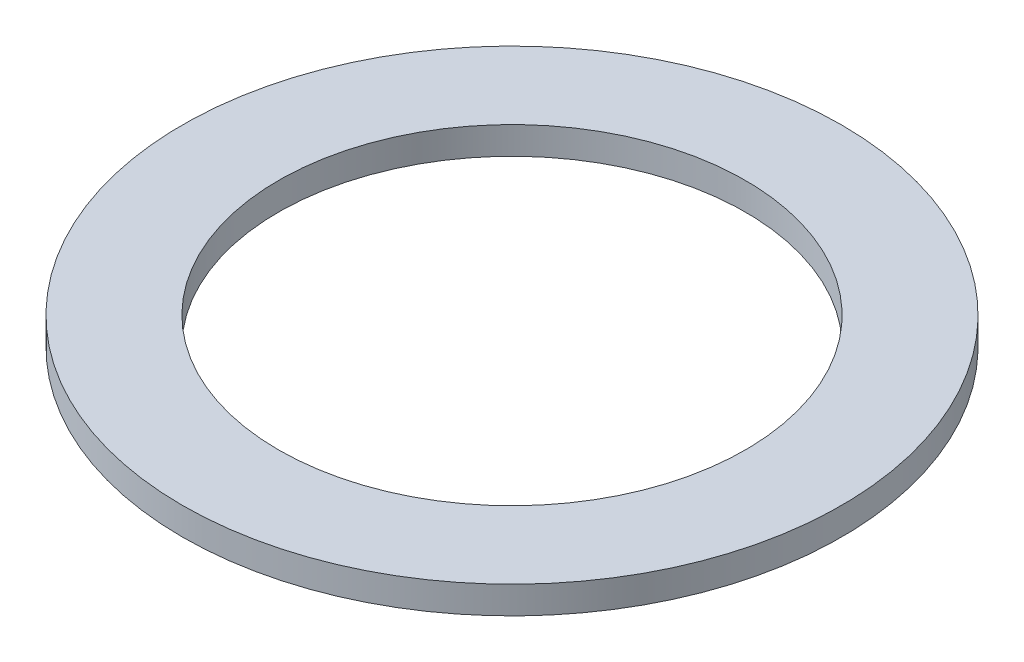
ISO-10303-21;
HEADER;
FILE_DESCRIPTION(('STEP AP214'),'2;1');
FILE_NAME('part.step','',(''),(''),'','','');
FILE_SCHEMA(('AUTOMOTIVE_DESIGN { 1 0 10303 214 1 1 1 1 }'));
ENDSEC;
DATA;
#1=APPLICATION_CONTEXT('core data for automotive mechanical design processes');
#2=APPLICATION_PROTOCOL_DEFINITION('international standard','automotive_design',2000,#1);
#3=PRODUCT_CONTEXT('',#1,'mechanical');
#4=PRODUCT('Part','Part','',(#3));
#5=PRODUCT_RELATED_PRODUCT_CATEGORY('part','',(#4));
#6=PRODUCT_DEFINITION_FORMATION('','',#4);
#7=PRODUCT_DEFINITION_CONTEXT('part definition',#1,'design');
#8=PRODUCT_DEFINITION('design','',#6,#7);
#9=PRODUCT_DEFINITION_SHAPE('','',#8);
#10=(LENGTH_UNIT() NAMED_UNIT(*) SI_UNIT(.MILLI.,.METRE.));
#11=(NAMED_UNIT(*) PLANE_ANGLE_UNIT() SI_UNIT($,.RADIAN.));
#12=(NAMED_UNIT(*) SI_UNIT($,.STERADIAN.) SOLID_ANGLE_UNIT());
#13=UNCERTAINTY_MEASURE_WITH_UNIT(LENGTH_MEASURE(1.E-05),#10,'distance_accuracy_value','');
#14=(GEOMETRIC_REPRESENTATION_CONTEXT(3) GLOBAL_UNCERTAINTY_ASSIGNED_CONTEXT((#13)) GLOBAL_UNIT_ASSIGNED_CONTEXT((#10,
#11,#12)) REPRESENTATION_CONTEXT('',''));
#15=CARTESIAN_POINT('',(0.,0.,0.));
#16=DIRECTION('',(0.,0.,1.));
#17=DIRECTION('',(1.,0.,0.));
#18=AXIS2_PLACEMENT_3D('',#15,#16,#17);
#19=CARTESIAN_POINT('',(0.,3.175,0.));
#20=DIRECTION('',(0.,1.,0.));
#21=DIRECTION('',(0.,0.,1.));
#22=AXIS2_PLACEMENT_3D('',#19,#20,#21);
#23=PLANE('',#22);
#24=CARTESIAN_POINT('',(0.,3.175,0.));
#25=DIRECTION('',(0.,1.,0.));
#26=DIRECTION('',(0.,0.,1.));
#27=AXIS2_PLACEMENT_3D('',#24,#25,#26);
#28=CIRCLE('',#27,76.2);
#29=CARTESIAN_POINT('',(0.,3.175,76.2));
#30=VERTEX_POINT('',#29);
#31=EDGE_CURVE('E10',#30,#30,#28,.T.);
#32=ORIENTED_EDGE('',*,*,#31,.T.);
#33=EDGE_LOOP('',(#32));
#34=FACE_BOUND('',#33,.T.);
#35=CARTESIAN_POINT('',(0.,3.175,0.));
#36=DIRECTION('',(0.,1.,0.));
#37=DIRECTION('',(0.,0.,1.));
#38=AXIS2_PLACEMENT_3D('',#35,#36,#37);
#39=CIRCLE('',#38,53.975);
#40=CARTESIAN_POINT('',(0.,3.175,53.975));
#41=VERTEX_POINT('',#40);
#42=EDGE_CURVE('E49',#41,#41,#39,.T.);
#43=ORIENTED_EDGE('',*,*,#42,.F.);
#44=EDGE_LOOP('',(#43));
#45=FACE_BOUND('',#44,.T.);
#46=ADVANCED_FACE('F35',(#34,#45),#23,.T.);
#47=CARTESIAN_POINT('',(0.,-3.175,0.));
#48=DIRECTION('',(0.,1.,0.));
#49=DIRECTION('',(0.,0.,1.));
#50=AXIS2_PLACEMENT_3D('',#47,#48,#49);
#51=PLANE('',#50);
#52=CARTESIAN_POINT('',(0.,-3.175,0.));
#53=DIRECTION('',(0.,1.,0.));
#54=DIRECTION('',(0.,0.,1.));
#55=AXIS2_PLACEMENT_3D('',#52,#53,#54);
#56=CIRCLE('',#55,76.2);
#57=CARTESIAN_POINT('',(0.,-3.175,76.2));
#58=VERTEX_POINT('',#57);
#59=EDGE_CURVE('E39',#58,#58,#56,.T.);
#60=ORIENTED_EDGE('',*,*,#59,.F.);
#61=EDGE_LOOP('',(#60));
#62=FACE_BOUND('',#61,.T.);
#63=CARTESIAN_POINT('',(0.,-3.175,0.));
#64=DIRECTION('',(0.,1.,0.));
#65=DIRECTION('',(0.,0.,1.));
#66=AXIS2_PLACEMENT_3D('',#63,#64,#65);
#67=CIRCLE('',#66,53.975);
#68=CARTESIAN_POINT('',(0.,-3.175,53.975));
#69=VERTEX_POINT('',#68);
#70=EDGE_CURVE('E51',#69,#69,#67,.T.);
#71=ORIENTED_EDGE('',*,*,#70,.T.);
#72=EDGE_LOOP('',(#71));
#73=FACE_BOUND('',#72,.T.);
#74=ADVANCED_FACE('F64',(#62,#73),#51,.F.);
#75=CARTESIAN_POINT('',(0.,3.175,0.));
#76=DIRECTION('',(0.,-1.,0.));
#77=DIRECTION('',(0.,0.,-1.));
#78=AXIS2_PLACEMENT_3D('',#75,#76,#77);
#79=CYLINDRICAL_SURFACE('',#78,76.2);
#80=ORIENTED_EDGE('',*,*,#31,.F.);
#81=EDGE_LOOP('',(#80));
#82=FACE_BOUND('',#81,.T.);
#83=ORIENTED_EDGE('',*,*,#59,.T.);
#84=EDGE_LOOP('',(#83));
#85=FACE_BOUND('',#84,.T.);
#86=ADVANCED_FACE('F37',(#82,#85),#79,.T.);
#87=CARTESIAN_POINT('',(0.,3.175,0.));
#88=DIRECTION('',(0.,-1.,0.));
#89=DIRECTION('',(0.,0.,-1.));
#90=AXIS2_PLACEMENT_3D('',#87,#88,#89);
#91=CYLINDRICAL_SURFACE('',#90,53.975);
#92=ORIENTED_EDGE('',*,*,#42,.T.);
#93=EDGE_LOOP('',(#92));
#94=FACE_BOUND('',#93,.T.);
#95=ORIENTED_EDGE('',*,*,#70,.F.);
#96=EDGE_LOOP('',(#95));
#97=FACE_BOUND('',#96,.T.);
#98=ADVANCED_FACE('F60',(#94,#97),#91,.F.);
#99=CLOSED_SHELL('',(#46,#74,#86,#98));
#100=MANIFOLD_SOLID_BREP('B2',#99);
#101=ADVANCED_BREP_SHAPE_REPRESENTATION('',(#18,#100),#14);
#102=SHAPE_DEFINITION_REPRESENTATION(#9,#101);
ENDSEC;
END-ISO-10303-21;
